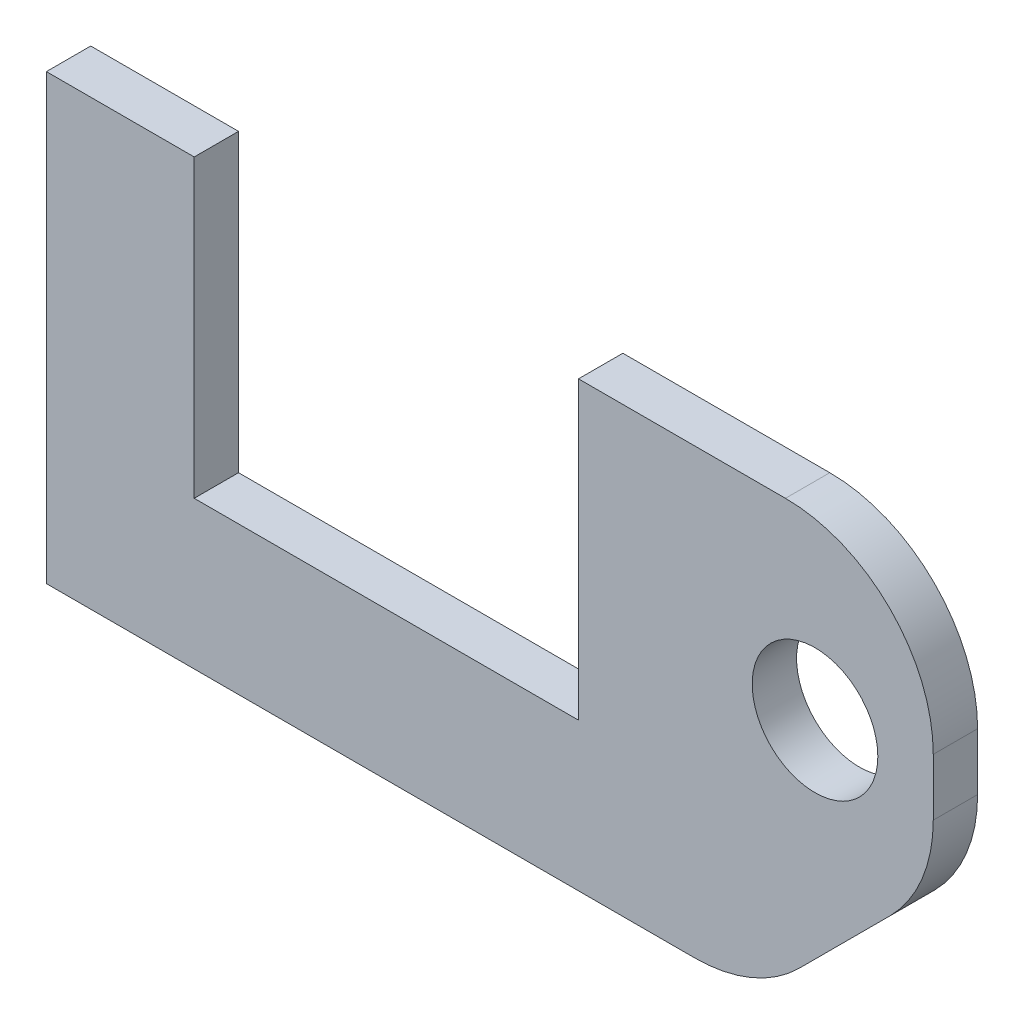
ISO-10303-21;
HEADER;
FILE_DESCRIPTION(('STEP AP214'),'2;1');
FILE_NAME('part.step','',(''),(''),'','','');
FILE_SCHEMA(('AUTOMOTIVE_DESIGN { 1 0 10303 214 1 1 1 1 }'));
ENDSEC;
DATA;
#1=APPLICATION_CONTEXT('core data for automotive mechanical design processes');
#2=APPLICATION_PROTOCOL_DEFINITION('international standard','automotive_design',2000,#1);
#3=PRODUCT_CONTEXT('',#1,'mechanical');
#4=PRODUCT('Part','Part','',(#3));
#5=PRODUCT_RELATED_PRODUCT_CATEGORY('part','',(#4));
#6=PRODUCT_DEFINITION_FORMATION('','',#4);
#7=PRODUCT_DEFINITION_CONTEXT('part definition',#1,'design');
#8=PRODUCT_DEFINITION('design','',#6,#7);
#9=PRODUCT_DEFINITION_SHAPE('','',#8);
#10=(LENGTH_UNIT() NAMED_UNIT(*) SI_UNIT(.MILLI.,.METRE.));
#11=(NAMED_UNIT(*) PLANE_ANGLE_UNIT() SI_UNIT($,.RADIAN.));
#12=(NAMED_UNIT(*) SI_UNIT($,.STERADIAN.) SOLID_ANGLE_UNIT());
#13=UNCERTAINTY_MEASURE_WITH_UNIT(LENGTH_MEASURE(1.E-05),#10,'distance_accuracy_value','');
#14=(GEOMETRIC_REPRESENTATION_CONTEXT(3) GLOBAL_UNCERTAINTY_ASSIGNED_CONTEXT((#13)) GLOBAL_UNIT_ASSIGNED_CONTEXT((#10,
#11,#12)) REPRESENTATION_CONTEXT('',''));
#15=CARTESIAN_POINT('',(0.,0.,0.));
#16=DIRECTION('',(0.,0.,1.));
#17=DIRECTION('',(1.,0.,0.));
#18=AXIS2_PLACEMENT_3D('',#15,#16,#17);
#19=CARTESIAN_POINT('',(0.,0.,3.));
#20=DIRECTION('',(0.,0.,1.));
#21=DIRECTION('',(1.,0.,0.));
#22=AXIS2_PLACEMENT_3D('',#19,#20,#21);
#23=PLANE('',#22);
#24=DIRECTION('',(-0.707106781186549,-0.707106781186546,0.));
#25=VECTOR('',#24,1.);
#26=CARTESIAN_POINT('',(23.9999999999999,-24.,3.));
#27=LINE('',#26,#25);
#28=CARTESIAN_POINT('',(50.9289321881345,2.92893218813451,3.));
#29=VERTEX_POINT('',#28);
#30=CARTESIAN_POINT('',(57.0710678118655,9.07106781186547,3.));
#31=VERTEX_POINT('',#30);
#32=EDGE_CURVE('E154',#29,#31,#27,.F.);
#33=ORIENTED_EDGE('',*,*,#32,.T.);
#34=CARTESIAN_POINT('',(50.,16.142135623731,3.));
#35=DIRECTION('',(0.,0.,1.));
#36=DIRECTION('',(1.,0.,0.));
#37=AXIS2_PLACEMENT_3D('',#34,#35,#36);
#38=CIRCLE('',#37,10.);
#39=CARTESIAN_POINT('',(60.,16.142135623731,3.));
#40=VERTEX_POINT('',#39);
#41=EDGE_CURVE('E42',#31,#40,#38,.T.);
#42=ORIENTED_EDGE('',*,*,#41,.T.);
#43=DIRECTION('',(0.,1.,0.));
#44=VECTOR('',#43,1.);
#45=CARTESIAN_POINT('',(60.,0.,3.));
#46=LINE('',#45,#44);
#47=CARTESIAN_POINT('',(60.,20.,3.));
#48=VERTEX_POINT('',#47);
#49=EDGE_CURVE('E184',#40,#48,#46,.T.);
#50=ORIENTED_EDGE('',*,*,#49,.T.);
#51=CARTESIAN_POINT('',(50.,20.,3.));
#52=DIRECTION('',(0.,0.,1.));
#53=DIRECTION('',(1.,0.,0.));
#54=AXIS2_PLACEMENT_3D('',#51,#52,#53);
#55=CIRCLE('',#54,10.);
#56=CARTESIAN_POINT('',(50.,30.,3.));
#57=VERTEX_POINT('',#56);
#58=EDGE_CURVE('E170',#48,#57,#55,.T.);
#59=ORIENTED_EDGE('',*,*,#58,.T.);
#60=DIRECTION('',(-1.,0.,0.));
#61=VECTOR('',#60,1.);
#62=CARTESIAN_POINT('',(60.,30.,3.));
#63=LINE('',#62,#61);
#64=CARTESIAN_POINT('',(36.,30.,3.));
#65=VERTEX_POINT('',#64);
#66=EDGE_CURVE('E192',#57,#65,#63,.T.);
#67=ORIENTED_EDGE('',*,*,#66,.T.);
#68=DIRECTION('',(0.,-1.,0.));
#69=VECTOR('',#68,1.);
#70=CARTESIAN_POINT('',(36.,30.,3.));
#71=LINE('',#70,#69);
#72=CARTESIAN_POINT('',(36.,10.,3.));
#73=VERTEX_POINT('',#72);
#74=EDGE_CURVE('E233',#65,#73,#71,.T.);
#75=ORIENTED_EDGE('',*,*,#74,.T.);
#76=DIRECTION('',(-1.,0.,0.));
#77=VECTOR('',#76,1.);
#78=CARTESIAN_POINT('',(36.,10.,3.));
#79=LINE('',#78,#77);
#80=CARTESIAN_POINT('',(10.,10.,3.));
#81=VERTEX_POINT('',#80);
#82=EDGE_CURVE('E245',#73,#81,#79,.T.);
#83=ORIENTED_EDGE('',*,*,#82,.T.);
#84=DIRECTION('',(0.,1.,0.));
#85=VECTOR('',#84,1.);
#86=CARTESIAN_POINT('',(10.,10.,3.));
#87=LINE('',#86,#85);
#88=CARTESIAN_POINT('',(10.,30.,3.));
#89=VERTEX_POINT('',#88);
#90=EDGE_CURVE('E142',#81,#89,#87,.T.);
#91=ORIENTED_EDGE('',*,*,#90,.T.);
#92=DIRECTION('',(-1.,0.,0.));
#93=VECTOR('',#92,1.);
#94=CARTESIAN_POINT('',(10.,30.,3.));
#95=LINE('',#94,#93);
#96=CARTESIAN_POINT('',(0.,30.,3.));
#97=VERTEX_POINT('',#96);
#98=EDGE_CURVE('E137',#89,#97,#95,.T.);
#99=ORIENTED_EDGE('',*,*,#98,.T.);
#100=DIRECTION('',(0.,-1.,0.));
#101=VECTOR('',#100,1.);
#102=CARTESIAN_POINT('',(0.,30.,3.));
#103=LINE('',#102,#101);
#104=CARTESIAN_POINT('',(0.,0.,3.));
#105=VERTEX_POINT('',#104);
#106=EDGE_CURVE('E125',#97,#105,#103,.T.);
#107=ORIENTED_EDGE('',*,*,#106,.T.);
#108=DIRECTION('',(1.,0.,0.));
#109=VECTOR('',#108,1.);
#110=CARTESIAN_POINT('',(0.,0.,3.));
#111=LINE('',#110,#109);
#112=CARTESIAN_POINT('',(43.857864376269,0.,3.));
#113=VERTEX_POINT('',#112);
#114=EDGE_CURVE('E136',#105,#113,#111,.T.);
#115=ORIENTED_EDGE('',*,*,#114,.T.);
#116=CARTESIAN_POINT('',(43.857864376269,10.,3.));
#117=DIRECTION('',(0.,0.,1.));
#118=DIRECTION('',(1.,0.,0.));
#119=AXIS2_PLACEMENT_3D('',#116,#117,#118);
#120=CIRCLE('',#119,10.);
#121=EDGE_CURVE('E49',#113,#29,#120,.T.);
#122=ORIENTED_EDGE('',*,*,#121,.T.);
#123=EDGE_LOOP('',(#33,#42,#50,#59,#67,#75,#83,#91,#99,#107,#115,#122));
#124=FACE_BOUND('',#123,.T.);
#125=CARTESIAN_POINT('',(52.,18.,3.));
#126=DIRECTION('',(0.,0.,1.));
#127=DIRECTION('',(1.,0.,0.));
#128=AXIS2_PLACEMENT_3D('',#125,#126,#127);
#129=CIRCLE('',#128,4.25);
#130=CARTESIAN_POINT('',(56.25,18.,3.));
#131=VERTEX_POINT('',#130);
#132=EDGE_CURVE('E249',#131,#131,#129,.T.);
#133=ORIENTED_EDGE('',*,*,#132,.F.);
#134=EDGE_LOOP('',(#133));
#135=FACE_BOUND('',#134,.T.);
#136=ADVANCED_FACE('F34',(#124,#135),#23,.T.);
#137=CARTESIAN_POINT('',(0.,0.,0.));
#138=DIRECTION('',(0.,0.,1.));
#139=DIRECTION('',(1.,0.,0.));
#140=AXIS2_PLACEMENT_3D('',#137,#138,#139);
#141=PLANE('',#140);
#142=DIRECTION('',(0.,1.,0.));
#143=VECTOR('',#142,1.);
#144=CARTESIAN_POINT('',(60.,0.,0.));
#145=LINE('',#144,#143);
#146=CARTESIAN_POINT('',(60.,16.142135623731,0.));
#147=VERTEX_POINT('',#146);
#148=CARTESIAN_POINT('',(60.,20.,0.));
#149=VERTEX_POINT('',#148);
#150=EDGE_CURVE('E199',#147,#149,#145,.T.);
#151=ORIENTED_EDGE('',*,*,#150,.F.);
#152=CARTESIAN_POINT('',(50.,16.142135623731,0.));
#153=DIRECTION('',(0.,0.,1.));
#154=DIRECTION('',(1.,0.,0.));
#155=AXIS2_PLACEMENT_3D('',#152,#153,#154);
#156=CIRCLE('',#155,10.);
#157=CARTESIAN_POINT('',(57.0710678118655,9.07106781186547,0.));
#158=VERTEX_POINT('',#157);
#159=EDGE_CURVE('E177',#147,#158,#156,.F.);
#160=ORIENTED_EDGE('',*,*,#159,.T.);
#161=DIRECTION('',(0.707106781186549,0.707106781186546,0.));
#162=VECTOR('',#161,1.);
#163=CARTESIAN_POINT('',(60.,12.,0.));
#164=LINE('',#163,#162);
#165=CARTESIAN_POINT('',(50.9289321881345,2.9289321881345,0.));
#166=VERTEX_POINT('',#165);
#167=EDGE_CURVE('E151',#158,#166,#164,.F.);
#168=ORIENTED_EDGE('',*,*,#167,.T.);
#169=CARTESIAN_POINT('',(43.857864376269,10.,0.));
#170=DIRECTION('',(0.,0.,1.));
#171=DIRECTION('',(1.,0.,0.));
#172=AXIS2_PLACEMENT_3D('',#169,#170,#171);
#173=CIRCLE('',#172,10.);
#174=CARTESIAN_POINT('',(43.857864376269,0.,0.));
#175=VERTEX_POINT('',#174);
#176=EDGE_CURVE('E175',#166,#175,#173,.F.);
#177=ORIENTED_EDGE('',*,*,#176,.T.);
#178=DIRECTION('',(1.,0.,0.));
#179=VECTOR('',#178,1.);
#180=CARTESIAN_POINT('',(0.,0.,0.));
#181=LINE('',#180,#179);
#182=CARTESIAN_POINT('',(0.,0.,0.));
#183=VERTEX_POINT('',#182);
#184=EDGE_CURVE('E203',#183,#175,#181,.T.);
#185=ORIENTED_EDGE('',*,*,#184,.F.);
#186=DIRECTION('',(0.,-1.,0.));
#187=VECTOR('',#186,1.);
#188=CARTESIAN_POINT('',(0.,30.,0.));
#189=LINE('',#188,#187);
#190=CARTESIAN_POINT('',(0.,30.,0.));
#191=VERTEX_POINT('',#190);
#192=EDGE_CURVE('E206',#191,#183,#189,.T.);
#193=ORIENTED_EDGE('',*,*,#192,.F.);
#194=DIRECTION('',(-1.,0.,0.));
#195=VECTOR('',#194,1.);
#196=CARTESIAN_POINT('',(10.,30.,0.));
#197=LINE('',#196,#195);
#198=CARTESIAN_POINT('',(10.,30.,0.));
#199=VERTEX_POINT('',#198);
#200=EDGE_CURVE('E150',#199,#191,#197,.T.);
#201=ORIENTED_EDGE('',*,*,#200,.F.);
#202=DIRECTION('',(0.,1.,0.));
#203=VECTOR('',#202,1.);
#204=CARTESIAN_POINT('',(10.,10.,0.));
#205=LINE('',#204,#203);
#206=CARTESIAN_POINT('',(10.,10.,0.));
#207=VERTEX_POINT('',#206);
#208=EDGE_CURVE('E146',#207,#199,#205,.T.);
#209=ORIENTED_EDGE('',*,*,#208,.F.);
#210=DIRECTION('',(-1.,0.,0.));
#211=VECTOR('',#210,1.);
#212=CARTESIAN_POINT('',(36.,10.,0.));
#213=LINE('',#212,#211);
#214=CARTESIAN_POINT('',(36.,10.,0.));
#215=VERTEX_POINT('',#214);
#216=EDGE_CURVE('E216',#215,#207,#213,.T.);
#217=ORIENTED_EDGE('',*,*,#216,.F.);
#218=DIRECTION('',(0.,-1.,0.));
#219=VECTOR('',#218,1.);
#220=CARTESIAN_POINT('',(36.,30.,0.));
#221=LINE('',#220,#219);
#222=CARTESIAN_POINT('',(36.,30.,0.));
#223=VERTEX_POINT('',#222);
#224=EDGE_CURVE('E214',#223,#215,#221,.T.);
#225=ORIENTED_EDGE('',*,*,#224,.F.);
#226=DIRECTION('',(-1.,0.,0.));
#227=VECTOR('',#226,1.);
#228=CARTESIAN_POINT('',(60.,30.,0.));
#229=LINE('',#228,#227);
#230=CARTESIAN_POINT('',(50.,30.,0.));
#231=VERTEX_POINT('',#230);
#232=EDGE_CURVE('E208',#231,#223,#229,.T.);
#233=ORIENTED_EDGE('',*,*,#232,.F.);
#234=CARTESIAN_POINT('',(50.,20.,0.));
#235=DIRECTION('',(0.,0.,1.));
#236=DIRECTION('',(1.,0.,0.));
#237=AXIS2_PLACEMENT_3D('',#234,#235,#236);
#238=CIRCLE('',#237,10.);
#239=EDGE_CURVE('E164',#231,#149,#238,.F.);
#240=ORIENTED_EDGE('',*,*,#239,.T.);
#241=EDGE_LOOP('',(#151,#160,#168,#177,#185,#193,#201,#209,#217,#225,#233,#240));
#242=FACE_BOUND('',#241,.T.);
#243=CARTESIAN_POINT('',(52.,18.,0.));
#244=DIRECTION('',(0.,0.,1.));
#245=DIRECTION('',(1.,0.,0.));
#246=AXIS2_PLACEMENT_3D('',#243,#244,#245);
#247=CIRCLE('',#246,4.25);
#248=CARTESIAN_POINT('',(56.25,18.,0.));
#249=VERTEX_POINT('',#248);
#250=EDGE_CURVE('E251',#249,#249,#247,.T.);
#251=ORIENTED_EDGE('',*,*,#250,.T.);
#252=EDGE_LOOP('',(#251));
#253=FACE_BOUND('',#252,.T.);
#254=ADVANCED_FACE('F196',(#242,#253),#141,.F.);
#255=CARTESIAN_POINT('',(10.,30.,3.));
#256=DIRECTION('',(0.,-1.,0.));
#257=DIRECTION('',(0.,0.,-1.));
#258=AXIS2_PLACEMENT_3D('',#255,#256,#257);
#259=PLANE('',#258);
#260=ORIENTED_EDGE('',*,*,#200,.T.);
#261=DIRECTION('',(0.,0.,-1.));
#262=VECTOR('',#261,1.);
#263=CARTESIAN_POINT('',(0.,30.,3.));
#264=LINE('',#263,#262);
#265=EDGE_CURVE('E129',#97,#191,#264,.T.);
#266=ORIENTED_EDGE('',*,*,#265,.F.);
#267=ORIENTED_EDGE('',*,*,#98,.F.);
#268=DIRECTION('',(0.,0.,-1.));
#269=VECTOR('',#268,1.);
#270=CARTESIAN_POINT('',(10.,30.,3.));
#271=LINE('',#270,#269);
#272=EDGE_CURVE('E219',#89,#199,#271,.T.);
#273=ORIENTED_EDGE('',*,*,#272,.T.);
#274=EDGE_LOOP('',(#260,#266,#267,#273));
#275=FACE_BOUND('',#274,.T.);
#276=ADVANCED_FACE('F148',(#275),#259,.F.);
#277=CARTESIAN_POINT('',(0.,30.,3.));
#278=DIRECTION('',(1.,0.,0.));
#279=DIRECTION('',(0.,1.,0.));
#280=AXIS2_PLACEMENT_3D('',#277,#278,#279);
#281=PLANE('',#280);
#282=ORIENTED_EDGE('',*,*,#192,.T.);
#283=DIRECTION('',(0.,0.,-1.));
#284=VECTOR('',#283,1.);
#285=CARTESIAN_POINT('',(0.,0.,3.));
#286=LINE('',#285,#284);
#287=EDGE_CURVE('E132',#105,#183,#286,.T.);
#288=ORIENTED_EDGE('',*,*,#287,.F.);
#289=ORIENTED_EDGE('',*,*,#106,.F.);
#290=ORIENTED_EDGE('',*,*,#265,.T.);
#291=EDGE_LOOP('',(#282,#288,#289,#290));
#292=FACE_BOUND('',#291,.T.);
#293=ADVANCED_FACE('F127',(#292),#281,.F.);
#294=CARTESIAN_POINT('',(0.,0.,3.));
#295=DIRECTION('',(0.,1.,0.));
#296=DIRECTION('',(0.,0.,1.));
#297=AXIS2_PLACEMENT_3D('',#294,#295,#296);
#298=PLANE('',#297);
#299=ORIENTED_EDGE('',*,*,#184,.T.);
#300=DIRECTION('',(0.,0.,-1.));
#301=VECTOR('',#300,1.);
#302=CARTESIAN_POINT('',(43.857864376269,0.,3.));
#303=LINE('',#302,#301);
#304=EDGE_CURVE('E11',#175,#113,#303,.F.);
#305=ORIENTED_EDGE('',*,*,#304,.T.);
#306=ORIENTED_EDGE('',*,*,#114,.F.);
#307=ORIENTED_EDGE('',*,*,#287,.T.);
#308=EDGE_LOOP('',(#299,#305,#306,#307));
#309=FACE_BOUND('',#308,.T.);
#310=ADVANCED_FACE('F205',(#309),#298,.F.);
#311=CARTESIAN_POINT('',(60.,0.,3.));
#312=DIRECTION('',(-1.,0.,0.));
#313=DIRECTION('',(0.,0.,1.));
#314=AXIS2_PLACEMENT_3D('',#311,#312,#313);
#315=PLANE('',#314);
#316=ORIENTED_EDGE('',*,*,#49,.F.);
#317=DIRECTION('',(0.,0.,1.));
#318=VECTOR('',#317,1.);
#319=CARTESIAN_POINT('',(60.,16.142135623731,0.));
#320=LINE('',#319,#318);
#321=EDGE_CURVE('E172',#40,#147,#320,.F.);
#322=ORIENTED_EDGE('',*,*,#321,.T.);
#323=ORIENTED_EDGE('',*,*,#150,.T.);
#324=DIRECTION('',(0.,0.,-1.));
#325=VECTOR('',#324,1.);
#326=CARTESIAN_POINT('',(60.,20.,3.));
#327=LINE('',#326,#325);
#328=EDGE_CURVE('E167',#149,#48,#327,.F.);
#329=ORIENTED_EDGE('',*,*,#328,.T.);
#330=EDGE_LOOP('',(#316,#322,#323,#329));
#331=FACE_BOUND('',#330,.T.);
#332=ADVANCED_FACE('F188',(#331),#315,.F.);
#333=CARTESIAN_POINT('',(60.,30.,3.));
#334=DIRECTION('',(0.,-1.,0.));
#335=DIRECTION('',(1.,0.,0.));
#336=AXIS2_PLACEMENT_3D('',#333,#334,#335);
#337=PLANE('',#336);
#338=ORIENTED_EDGE('',*,*,#66,.F.);
#339=DIRECTION('',(0.,0.,-1.));
#340=VECTOR('',#339,1.);
#341=CARTESIAN_POINT('',(50.,30.,3.));
#342=LINE('',#341,#340);
#343=EDGE_CURVE('E161',#57,#231,#342,.T.);
#344=ORIENTED_EDGE('',*,*,#343,.T.);
#345=ORIENTED_EDGE('',*,*,#232,.T.);
#346=DIRECTION('',(0.,0.,-1.));
#347=VECTOR('',#346,1.);
#348=CARTESIAN_POINT('',(36.,30.,3.));
#349=LINE('',#348,#347);
#350=EDGE_CURVE('E156',#65,#223,#349,.T.);
#351=ORIENTED_EDGE('',*,*,#350,.F.);
#352=EDGE_LOOP('',(#338,#344,#345,#351));
#353=FACE_BOUND('',#352,.T.);
#354=ADVANCED_FACE('F260',(#353),#337,.F.);
#355=CARTESIAN_POINT('',(36.,30.,3.));
#356=DIRECTION('',(1.,0.,0.));
#357=DIRECTION('',(0.,0.,-1.));
#358=AXIS2_PLACEMENT_3D('',#355,#356,#357);
#359=PLANE('',#358);
#360=ORIENTED_EDGE('',*,*,#224,.T.);
#361=DIRECTION('',(0.,0.,-1.));
#362=VECTOR('',#361,1.);
#363=CARTESIAN_POINT('',(36.,10.,3.));
#364=LINE('',#363,#362);
#365=EDGE_CURVE('E224',#73,#215,#364,.T.);
#366=ORIENTED_EDGE('',*,*,#365,.F.);
#367=ORIENTED_EDGE('',*,*,#74,.F.);
#368=ORIENTED_EDGE('',*,*,#350,.T.);
#369=EDGE_LOOP('',(#360,#366,#367,#368));
#370=FACE_BOUND('',#369,.T.);
#371=ADVANCED_FACE('F231',(#370),#359,.F.);
#372=CARTESIAN_POINT('',(36.,10.,3.));
#373=DIRECTION('',(0.,-1.,0.));
#374=DIRECTION('',(1.,0.,0.));
#375=AXIS2_PLACEMENT_3D('',#372,#373,#374);
#376=PLANE('',#375);
#377=ORIENTED_EDGE('',*,*,#216,.T.);
#378=DIRECTION('',(0.,0.,-1.));
#379=VECTOR('',#378,1.);
#380=CARTESIAN_POINT('',(10.,10.,3.));
#381=LINE('',#380,#379);
#382=EDGE_CURVE('E221',#81,#207,#381,.T.);
#383=ORIENTED_EDGE('',*,*,#382,.F.);
#384=ORIENTED_EDGE('',*,*,#82,.F.);
#385=ORIENTED_EDGE('',*,*,#365,.T.);
#386=EDGE_LOOP('',(#377,#383,#384,#385));
#387=FACE_BOUND('',#386,.T.);
#388=ADVANCED_FACE('F241',(#387),#376,.F.);
#389=CARTESIAN_POINT('',(10.,10.,3.));
#390=DIRECTION('',(-1.,0.,0.));
#391=DIRECTION('',(0.,-1.,0.));
#392=AXIS2_PLACEMENT_3D('',#389,#390,#391);
#393=PLANE('',#392);
#394=ORIENTED_EDGE('',*,*,#208,.T.);
#395=ORIENTED_EDGE('',*,*,#272,.F.);
#396=ORIENTED_EDGE('',*,*,#90,.F.);
#397=ORIENTED_EDGE('',*,*,#382,.T.);
#398=EDGE_LOOP('',(#394,#395,#396,#397));
#399=FACE_BOUND('',#398,.T.);
#400=ADVANCED_FACE('F244',(#399),#393,.F.);
#401=CARTESIAN_POINT('',(52.,18.,3.));
#402=DIRECTION('',(0.,0.,-1.));
#403=DIRECTION('',(-1.,0.,0.));
#404=AXIS2_PLACEMENT_3D('',#401,#402,#403);
#405=CYLINDRICAL_SURFACE('',#404,4.25);
#406=ORIENTED_EDGE('',*,*,#132,.T.);
#407=EDGE_LOOP('',(#406));
#408=FACE_BOUND('',#407,.T.);
#409=ORIENTED_EDGE('',*,*,#250,.F.);
#410=EDGE_LOOP('',(#409));
#411=FACE_BOUND('',#410,.T.);
#412=ADVANCED_FACE('F269',(#408,#411),#405,.F.);
#413=CARTESIAN_POINT('',(60.,12.,3.));
#414=DIRECTION('',(-0.707106781186546,0.707106781186549,0.));
#415=DIRECTION('',(0.,0.,-1.));
#416=AXIS2_PLACEMENT_3D('',#413,#414,#415);
#417=PLANE('',#416);
#418=ORIENTED_EDGE('',*,*,#167,.F.);
#419=DIRECTION('',(0.,0.,-1.));
#420=VECTOR('',#419,1.);
#421=CARTESIAN_POINT('',(57.0710678118655,9.07106781186547,3.));
#422=LINE('',#421,#420);
#423=EDGE_CURVE('E56',#158,#31,#422,.F.);
#424=ORIENTED_EDGE('',*,*,#423,.T.);
#425=ORIENTED_EDGE('',*,*,#32,.F.);
#426=DIRECTION('',(0.,0.,1.));
#427=VECTOR('',#426,1.);
#428=CARTESIAN_POINT('',(50.9289321881345,2.92893218813451,0.));
#429=LINE('',#428,#427);
#430=EDGE_CURVE('E179',#29,#166,#429,.F.);
#431=ORIENTED_EDGE('',*,*,#430,.T.);
#432=EDGE_LOOP('',(#418,#424,#425,#431));
#433=FACE_BOUND('',#432,.T.);
#434=ADVANCED_FACE('F200',(#433),#417,.F.);
#435=CARTESIAN_POINT('',(50.,20.,3.));
#436=DIRECTION('',(0.,0.,-1.));
#437=DIRECTION('',(-1.,0.,0.));
#438=AXIS2_PLACEMENT_3D('',#435,#436,#437);
#439=CYLINDRICAL_SURFACE('',#438,10.);
#440=ORIENTED_EDGE('',*,*,#58,.F.);
#441=ORIENTED_EDGE('',*,*,#328,.F.);
#442=ORIENTED_EDGE('',*,*,#239,.F.);
#443=ORIENTED_EDGE('',*,*,#343,.F.);
#444=EDGE_LOOP('',(#440,#441,#442,#443));
#445=FACE_BOUND('',#444,.T.);
#446=ADVANCED_FACE('F262',(#445),#439,.T.);
#447=CARTESIAN_POINT('',(50.,16.142135623731,3.));
#448=DIRECTION('',(0.,0.,-1.));
#449=DIRECTION('',(-1.,0.,0.));
#450=AXIS2_PLACEMENT_3D('',#447,#448,#449);
#451=CYLINDRICAL_SURFACE('',#450,10.);
#452=ORIENTED_EDGE('',*,*,#41,.F.);
#453=ORIENTED_EDGE('',*,*,#423,.F.);
#454=ORIENTED_EDGE('',*,*,#159,.F.);
#455=ORIENTED_EDGE('',*,*,#321,.F.);
#456=EDGE_LOOP('',(#452,#453,#454,#455));
#457=FACE_BOUND('',#456,.T.);
#458=ADVANCED_FACE('F194',(#457),#451,.T.);
#459=CARTESIAN_POINT('',(43.857864376269,10.,3.));
#460=DIRECTION('',(0.,0.,1.));
#461=DIRECTION('',(1.,0.,0.));
#462=AXIS2_PLACEMENT_3D('',#459,#460,#461);
#463=CYLINDRICAL_SURFACE('',#462,10.);
#464=ORIENTED_EDGE('',*,*,#176,.F.);
#465=ORIENTED_EDGE('',*,*,#430,.F.);
#466=ORIENTED_EDGE('',*,*,#121,.F.);
#467=ORIENTED_EDGE('',*,*,#304,.F.);
#468=EDGE_LOOP('',(#464,#465,#466,#467));
#469=FACE_BOUND('',#468,.T.);
#470=ADVANCED_FACE('F36',(#469),#463,.T.);
#471=CLOSED_SHELL('',(#136,#254,#276,#293,#310,#332,#354,#371,#388,#400,#412,#434,#446,#458,#470));
#472=MANIFOLD_SOLID_BREP('B2',#471);
#473=ADVANCED_BREP_SHAPE_REPRESENTATION('',(#18,#472),#14);
#474=SHAPE_DEFINITION_REPRESENTATION(#9,#473);
ENDSEC;
END-ISO-10303-21;
